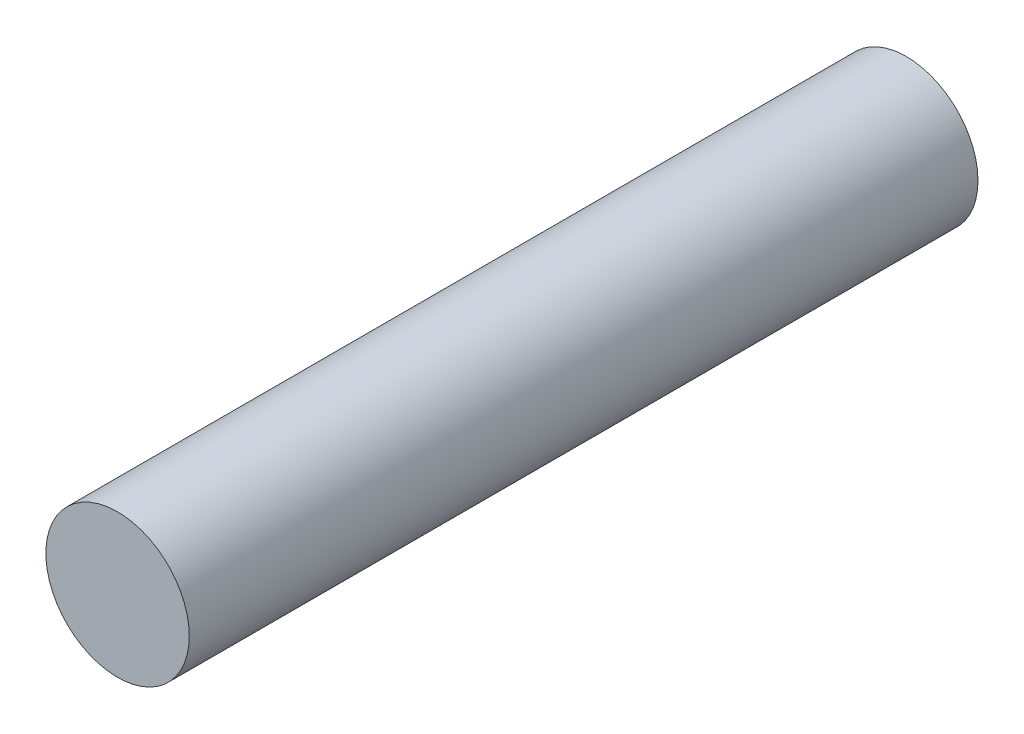
ISO-10303-21;
HEADER;
FILE_DESCRIPTION(('STEP AP214'),'2;1');
FILE_NAME('part.step','',(''),(''),'','','');
FILE_SCHEMA(('AUTOMOTIVE_DESIGN { 1 0 10303 214 1 1 1 1 }'));
ENDSEC;
DATA;
#1=APPLICATION_CONTEXT('core data for automotive mechanical design processes');
#2=APPLICATION_PROTOCOL_DEFINITION('international standard','automotive_design',2000,#1);
#3=PRODUCT_CONTEXT('',#1,'mechanical');
#4=PRODUCT('Part','Part','',(#3));
#5=PRODUCT_RELATED_PRODUCT_CATEGORY('part','',(#4));
#6=PRODUCT_DEFINITION_FORMATION('','',#4);
#7=PRODUCT_DEFINITION_CONTEXT('part definition',#1,'design');
#8=PRODUCT_DEFINITION('design','',#6,#7);
#9=PRODUCT_DEFINITION_SHAPE('','',#8);
#10=(LENGTH_UNIT() NAMED_UNIT(*) SI_UNIT(.MILLI.,.METRE.));
#11=(NAMED_UNIT(*) PLANE_ANGLE_UNIT() SI_UNIT($,.RADIAN.));
#12=(NAMED_UNIT(*) SI_UNIT($,.STERADIAN.) SOLID_ANGLE_UNIT());
#13=UNCERTAINTY_MEASURE_WITH_UNIT(LENGTH_MEASURE(1.E-05),#10,'distance_accuracy_value','');
#14=(GEOMETRIC_REPRESENTATION_CONTEXT(3) GLOBAL_UNCERTAINTY_ASSIGNED_CONTEXT((#13)) GLOBAL_UNIT_ASSIGNED_CONTEXT((#10,
#11,#12)) REPRESENTATION_CONTEXT('',''));
#15=CARTESIAN_POINT('',(0.,0.,0.));
#16=DIRECTION('',(0.,0.,1.));
#17=DIRECTION('',(1.,0.,0.));
#18=AXIS2_PLACEMENT_3D('',#15,#16,#17);
#19=CARTESIAN_POINT('',(0.,0.,16.5));
#20=DIRECTION('',(0.,0.,-1.));
#21=DIRECTION('',(-1.,0.,0.));
#22=AXIS2_PLACEMENT_3D('',#19,#20,#21);
#23=CYLINDRICAL_SURFACE('',#22,1.5);
#24=CARTESIAN_POINT('',(0.,0.,16.5));
#25=DIRECTION('',(0.,0.,1.));
#26=DIRECTION('',(1.,0.,0.));
#27=AXIS2_PLACEMENT_3D('',#24,#25,#26);
#28=CIRCLE('',#27,1.5);
#29=CARTESIAN_POINT('',(1.5,0.,16.5));
#30=VERTEX_POINT('',#29);
#31=EDGE_CURVE('E10',#30,#30,#28,.T.);
#32=ORIENTED_EDGE('',*,*,#31,.F.);
#33=EDGE_LOOP('',(#32));
#34=FACE_BOUND('',#33,.T.);
#35=CARTESIAN_POINT('',(0.,0.,0.));
#36=DIRECTION('',(0.,0.,1.));
#37=DIRECTION('',(1.,0.,0.));
#38=AXIS2_PLACEMENT_3D('',#35,#36,#37);
#39=CIRCLE('',#38,1.5);
#40=CARTESIAN_POINT('',(1.5,0.,0.));
#41=VERTEX_POINT('',#40);
#42=EDGE_CURVE('E37',#41,#41,#39,.T.);
#43=ORIENTED_EDGE('',*,*,#42,.T.);
#44=EDGE_LOOP('',(#43));
#45=FACE_BOUND('',#44,.T.);
#46=ADVANCED_FACE('F34',(#34,#45),#23,.T.);
#47=CARTESIAN_POINT('',(0.,0.,16.5));
#48=DIRECTION('',(0.,0.,1.));
#49=DIRECTION('',(1.,0.,0.));
#50=AXIS2_PLACEMENT_3D('',#47,#48,#49);
#51=PLANE('',#50);
#52=ORIENTED_EDGE('',*,*,#31,.T.);
#53=EDGE_LOOP('',(#52));
#54=FACE_BOUND('',#53,.T.);
#55=ADVANCED_FACE('F49',(#54),#51,.T.);
#56=CARTESIAN_POINT('',(0.,0.,0.));
#57=DIRECTION('',(0.,0.,1.));
#58=DIRECTION('',(1.,0.,0.));
#59=AXIS2_PLACEMENT_3D('',#56,#57,#58);
#60=PLANE('',#59);
#61=ORIENTED_EDGE('',*,*,#42,.F.);
#62=EDGE_LOOP('',(#61));
#63=FACE_BOUND('',#62,.T.);
#64=ADVANCED_FACE('F47',(#63),#60,.F.);
#65=CLOSED_SHELL('',(#46,#55,#64));
#66=MANIFOLD_SOLID_BREP('B2',#65);
#67=ADVANCED_BREP_SHAPE_REPRESENTATION('',(#18,#66),#14);
#68=SHAPE_DEFINITION_REPRESENTATION(#9,#67);
ENDSEC;
END-ISO-10303-21;
